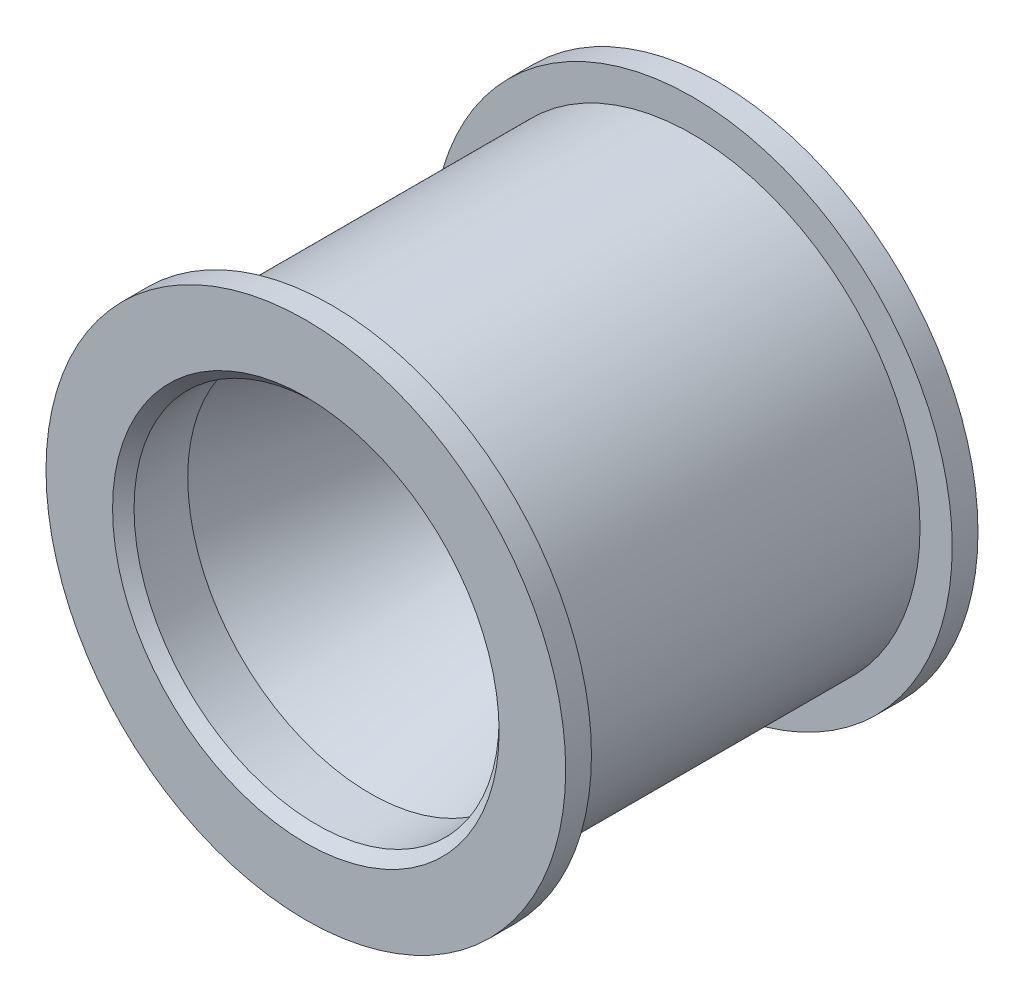
ISO-10303-21;
HEADER;
FILE_DESCRIPTION(('STEP AP214'),'2;1');
FILE_NAME('part.step','',(''),(''),'','','');
FILE_SCHEMA(('AUTOMOTIVE_DESIGN { 1 0 10303 214 1 1 1 1 }'));
ENDSEC;
DATA;
#1=APPLICATION_CONTEXT('core data for automotive mechanical design processes');
#2=APPLICATION_PROTOCOL_DEFINITION('international standard','automotive_design',2000,#1);
#3=PRODUCT_CONTEXT('',#1,'mechanical');
#4=PRODUCT('Part','Part','',(#3));
#5=PRODUCT_RELATED_PRODUCT_CATEGORY('part','',(#4));
#6=PRODUCT_DEFINITION_FORMATION('','',#4);
#7=PRODUCT_DEFINITION_CONTEXT('part definition',#1,'design');
#8=PRODUCT_DEFINITION('design','',#6,#7);
#9=PRODUCT_DEFINITION_SHAPE('','',#8);
#10=(LENGTH_UNIT() NAMED_UNIT(*) SI_UNIT(.MILLI.,.METRE.));
#11=(NAMED_UNIT(*) PLANE_ANGLE_UNIT() SI_UNIT($,.RADIAN.));
#12=(NAMED_UNIT(*) SI_UNIT($,.STERADIAN.) SOLID_ANGLE_UNIT());
#13=UNCERTAINTY_MEASURE_WITH_UNIT(LENGTH_MEASURE(1.E-05),#10,'distance_accuracy_value','');
#14=(GEOMETRIC_REPRESENTATION_CONTEXT(3) GLOBAL_UNCERTAINTY_ASSIGNED_CONTEXT((#13)) GLOBAL_UNIT_ASSIGNED_CONTEXT((#10,
#11,#12)) REPRESENTATION_CONTEXT('',''));
#15=CARTESIAN_POINT('',(0.,0.,0.));
#16=DIRECTION('',(0.,0.,1.));
#17=DIRECTION('',(1.,0.,0.));
#18=AXIS2_PLACEMENT_3D('',#15,#16,#17);
#19=CARTESIAN_POINT('',(0.,0.,9.6));
#20=DIRECTION('',(0.,0.,-1.));
#21=DIRECTION('',(-1.,0.,0.));
#22=AXIS2_PLACEMENT_3D('',#19,#20,#21);
#23=CYLINDRICAL_SURFACE('',#22,1.65);
#24=CARTESIAN_POINT('',(0.,0.,-3.1));
#25=DIRECTION('',(0.,0.,-1.));
#26=DIRECTION('',(-1.,0.,0.));
#27=AXIS2_PLACEMENT_3D('',#24,#25,#26);
#28=CIRCLE('',#27,1.65);
#29=CARTESIAN_POINT('',(-1.65,0.,-3.1));
#30=VERTEX_POINT('',#29);
#31=EDGE_CURVE('E60',#30,#30,#28,.F.);
#32=ORIENTED_EDGE('',*,*,#31,.T.);
#33=EDGE_LOOP('',(#32));
#34=FACE_BOUND('',#33,.T.);
#35=CARTESIAN_POINT('',(0.,0.,-5.1));
#36=DIRECTION('',(0.,0.,-1.));
#37=DIRECTION('',(-1.,0.,0.));
#38=AXIS2_PLACEMENT_3D('',#35,#36,#37);
#39=CIRCLE('',#38,1.65);
#40=CARTESIAN_POINT('',(-1.65,0.,-5.1));
#41=VERTEX_POINT('',#40);
#42=EDGE_CURVE('E63',#41,#41,#39,.T.);
#43=ORIENTED_EDGE('',*,*,#42,.T.);
#44=EDGE_LOOP('',(#43));
#45=FACE_BOUND('',#44,.T.);
#46=ADVANCED_FACE('F37',(#34,#45),#23,.F.);
#47=CARTESIAN_POINT('',(0.,0.,-8.4));
#48=DIRECTION('',(0.,0.,1.));
#49=DIRECTION('',(1.,0.,0.));
#50=AXIS2_PLACEMENT_3D('',#47,#48,#49);
#51=CYLINDRICAL_SURFACE('',#50,10.6);
#52=CARTESIAN_POINT('',(0.,0.,-8.4));
#53=DIRECTION('',(0.,0.,1.));
#54=DIRECTION('',(1.,0.,0.));
#55=AXIS2_PLACEMENT_3D('',#52,#53,#54);
#56=CIRCLE('',#55,10.6);
#57=CARTESIAN_POINT('',(10.6,0.,-8.4));
#58=VERTEX_POINT('',#57);
#59=EDGE_CURVE('E76',#58,#58,#56,.T.);
#60=ORIENTED_EDGE('',*,*,#59,.T.);
#61=EDGE_LOOP('',(#60));
#62=FACE_BOUND('',#61,.T.);
#63=CARTESIAN_POINT('',(0.,0.,8.4));
#64=DIRECTION('',(0.,0.,1.));
#65=DIRECTION('',(1.,0.,0.));
#66=AXIS2_PLACEMENT_3D('',#63,#64,#65);
#67=CIRCLE('',#66,10.6);
#68=CARTESIAN_POINT('',(10.6,0.,8.4));
#69=VERTEX_POINT('',#68);
#70=EDGE_CURVE('E75',#69,#69,#67,.T.);
#71=ORIENTED_EDGE('',*,*,#70,.F.);
#72=EDGE_LOOP('',(#71));
#73=FACE_BOUND('',#72,.T.);
#74=ADVANCED_FACE('F118',(#62,#73),#51,.T.);
#75=CARTESIAN_POINT('',(0.,0.,9.6));
#76=DIRECTION('',(0.,0.,-1.));
#77=DIRECTION('',(-1.,0.,0.));
#78=AXIS2_PLACEMENT_3D('',#75,#76,#77);
#79=CYLINDRICAL_SURFACE('',#78,12.1);
#80=CARTESIAN_POINT('',(0.,0.,9.6));
#81=DIRECTION('',(0.,0.,1.));
#82=DIRECTION('',(1.,0.,0.));
#83=AXIS2_PLACEMENT_3D('',#80,#81,#82);
#84=CIRCLE('',#83,12.1);
#85=CARTESIAN_POINT('',(12.1,0.,9.6));
#86=VERTEX_POINT('',#85);
#87=EDGE_CURVE('E83',#86,#86,#84,.T.);
#88=ORIENTED_EDGE('',*,*,#87,.F.);
#89=EDGE_LOOP('',(#88));
#90=FACE_BOUND('',#89,.T.);
#91=CARTESIAN_POINT('',(0.,0.,8.4));
#92=DIRECTION('',(0.,0.,1.));
#93=DIRECTION('',(1.,0.,0.));
#94=AXIS2_PLACEMENT_3D('',#91,#92,#93);
#95=CIRCLE('',#94,12.1);
#96=CARTESIAN_POINT('',(12.1,0.,8.4));
#97=VERTEX_POINT('',#96);
#98=EDGE_CURVE('E79',#97,#97,#95,.T.);
#99=ORIENTED_EDGE('',*,*,#98,.T.);
#100=EDGE_LOOP('',(#99));
#101=FACE_BOUND('',#100,.T.);
#102=ADVANCED_FACE('F124',(#90,#101),#79,.T.);
#103=CARTESIAN_POINT('',(0.,0.,9.6));
#104=DIRECTION('',(0.,0.,1.));
#105=DIRECTION('',(1.,0.,0.));
#106=AXIS2_PLACEMENT_3D('',#103,#104,#105);
#107=PLANE('',#106);
#108=CARTESIAN_POINT('',(0.,0.,9.6));
#109=DIRECTION('',(0.,0.,1.));
#110=DIRECTION('',(1.,0.,0.));
#111=AXIS2_PLACEMENT_3D('',#108,#109,#110);
#112=CIRCLE('',#111,9.);
#113=CARTESIAN_POINT('',(9.,0.,9.6));
#114=VERTEX_POINT('',#113);
#115=EDGE_CURVE('E44',#114,#114,#112,.F.);
#116=ORIENTED_EDGE('',*,*,#115,.T.);
#117=EDGE_LOOP('',(#116));
#118=FACE_BOUND('',#117,.T.);
#119=ORIENTED_EDGE('',*,*,#87,.T.);
#120=EDGE_LOOP('',(#119));
#121=FACE_BOUND('',#120,.T.);
#122=ADVANCED_FACE('F146',(#118,#121),#107,.T.);
#123=CARTESIAN_POINT('',(0.,0.,8.4));
#124=DIRECTION('',(0.,0.,1.));
#125=DIRECTION('',(1.,0.,0.));
#126=AXIS2_PLACEMENT_3D('',#123,#124,#125);
#127=PLANE('',#126);
#128=ORIENTED_EDGE('',*,*,#70,.T.);
#129=EDGE_LOOP('',(#128));
#130=FACE_BOUND('',#129,.T.);
#131=ORIENTED_EDGE('',*,*,#98,.F.);
#132=EDGE_LOOP('',(#131));
#133=FACE_BOUND('',#132,.T.);
#134=ADVANCED_FACE('F144',(#130,#133),#127,.F.);
#135=CARTESIAN_POINT('',(0.,0.,-9.6));
#136=DIRECTION('',(0.,0.,1.));
#137=DIRECTION('',(1.,0.,0.));
#138=AXIS2_PLACEMENT_3D('',#135,#136,#137);
#139=CYLINDRICAL_SURFACE('',#138,12.1);
#140=CARTESIAN_POINT('',(0.,0.,-9.6));
#141=DIRECTION('',(0.,0.,1.));
#142=DIRECTION('',(1.,0.,0.));
#143=AXIS2_PLACEMENT_3D('',#140,#141,#142);
#144=CIRCLE('',#143,12.1);
#145=CARTESIAN_POINT('',(12.1,0.,-9.6));
#146=VERTEX_POINT('',#145);
#147=EDGE_CURVE('E80',#146,#146,#144,.T.);
#148=ORIENTED_EDGE('',*,*,#147,.T.);
#149=EDGE_LOOP('',(#148));
#150=FACE_BOUND('',#149,.T.);
#151=CARTESIAN_POINT('',(0.,0.,-8.4));
#152=DIRECTION('',(0.,0.,1.));
#153=DIRECTION('',(1.,0.,0.));
#154=AXIS2_PLACEMENT_3D('',#151,#152,#153);
#155=CIRCLE('',#154,12.1);
#156=CARTESIAN_POINT('',(12.1,0.,-8.4));
#157=VERTEX_POINT('',#156);
#158=EDGE_CURVE('E88',#157,#157,#155,.T.);
#159=ORIENTED_EDGE('',*,*,#158,.F.);
#160=EDGE_LOOP('',(#159));
#161=FACE_BOUND('',#160,.T.);
#162=ADVANCED_FACE('F136',(#150,#161),#139,.T.);
#163=CARTESIAN_POINT('',(0.,0.,-9.6));
#164=DIRECTION('',(0.,0.,-1.));
#165=DIRECTION('',(1.,0.,0.));
#166=AXIS2_PLACEMENT_3D('',#163,#164,#165);
#167=PLANE('',#166);
#168=CARTESIAN_POINT('',(0.,0.,-9.6));
#169=DIRECTION('',(0.,0.,-1.));
#170=DIRECTION('',(-1.,0.,0.));
#171=AXIS2_PLACEMENT_3D('',#168,#169,#170);
#172=CIRCLE('',#171,4.60000000000001);
#173=CARTESIAN_POINT('',(-4.60000000000001,0.,-9.6));
#174=VERTEX_POINT('',#173);
#175=EDGE_CURVE('E48',#174,#174,#172,.F.);
#176=ORIENTED_EDGE('',*,*,#175,.T.);
#177=EDGE_LOOP('',(#176));
#178=FACE_BOUND('',#177,.T.);
#179=ORIENTED_EDGE('',*,*,#147,.F.);
#180=EDGE_LOOP('',(#179));
#181=FACE_BOUND('',#180,.T.);
#182=ADVANCED_FACE('F132',(#178,#181),#167,.T.);
#183=CARTESIAN_POINT('',(0.,0.,-8.4));
#184=DIRECTION('',(0.,0.,-1.));
#185=DIRECTION('',(1.,0.,0.));
#186=AXIS2_PLACEMENT_3D('',#183,#184,#185);
#187=PLANE('',#186);
#188=ORIENTED_EDGE('',*,*,#59,.F.);
#189=EDGE_LOOP('',(#188));
#190=FACE_BOUND('',#189,.T.);
#191=ORIENTED_EDGE('',*,*,#158,.T.);
#192=EDGE_LOOP('',(#191));
#193=FACE_BOUND('',#192,.T.);
#194=ADVANCED_FACE('F135',(#190,#193),#187,.F.);
#195=CARTESIAN_POINT('',(0.,0.,-5.6));
#196=DIRECTION('',(0.,0.,-1.));
#197=DIRECTION('',(-1.,0.,0.));
#198=AXIS2_PLACEMENT_3D('',#195,#196,#197);
#199=PLANE('',#198);
#200=CARTESIAN_POINT('',(0.,0.,-5.6));
#201=DIRECTION('',(0.,0.,-1.));
#202=DIRECTION('',(-1.,0.,0.));
#203=AXIS2_PLACEMENT_3D('',#200,#201,#202);
#204=CIRCLE('',#203,2.15);
#205=CARTESIAN_POINT('',(-2.15,0.,-5.6));
#206=VERTEX_POINT('',#205);
#207=EDGE_CURVE('E57',#206,#206,#204,.F.);
#208=ORIENTED_EDGE('',*,*,#207,.T.);
#209=EDGE_LOOP('',(#208));
#210=FACE_BOUND('',#209,.T.);
#211=CARTESIAN_POINT('',(0.,0.,-5.6));
#212=DIRECTION('',(0.,0.,-1.));
#213=DIRECTION('',(-1.,0.,0.));
#214=AXIS2_PLACEMENT_3D('',#211,#212,#213);
#215=CIRCLE('',#214,4.1);
#216=CARTESIAN_POINT('',(-4.1,0.,-5.6));
#217=VERTEX_POINT('',#216);
#218=EDGE_CURVE('E91',#217,#217,#215,.T.);
#219=ORIENTED_EDGE('',*,*,#218,.T.);
#220=EDGE_LOOP('',(#219));
#221=FACE_BOUND('',#220,.T.);
#222=ADVANCED_FACE('F140',(#210,#221),#199,.T.);
#223=CARTESIAN_POINT('',(0.,0.,-5.6));
#224=DIRECTION('',(0.,0.,-1.));
#225=DIRECTION('',(-1.,0.,0.));
#226=AXIS2_PLACEMENT_3D('',#223,#224,#225);
#227=CYLINDRICAL_SURFACE('',#226,4.1);
#228=CARTESIAN_POINT('',(0.,0.,-9.09999999999999));
#229=DIRECTION('',(0.,0.,-1.));
#230=DIRECTION('',(-1.,0.,0.));
#231=AXIS2_PLACEMENT_3D('',#228,#229,#230);
#232=CIRCLE('',#231,4.1);
#233=CARTESIAN_POINT('',(-4.1,0.,-9.09999999999999));
#234=VERTEX_POINT('',#233);
#235=EDGE_CURVE('E52',#234,#234,#232,.T.);
#236=ORIENTED_EDGE('',*,*,#235,.T.);
#237=EDGE_LOOP('',(#236));
#238=FACE_BOUND('',#237,.T.);
#239=ORIENTED_EDGE('',*,*,#218,.F.);
#240=EDGE_LOOP('',(#239));
#241=FACE_BOUND('',#240,.T.);
#242=ADVANCED_FACE('F130',(#238,#241),#227,.F.);
#243=CARTESIAN_POINT('',(0.,6.,-2.6));
#244=DIRECTION('',(0.,0.,-1.));
#245=DIRECTION('',(-1.,0.,0.));
#246=AXIS2_PLACEMENT_3D('',#243,#244,#245);
#247=PLANE('',#246);
#248=CARTESIAN_POINT('',(0.,0.,-2.6));
#249=DIRECTION('',(0.,0.,-1.));
#250=DIRECTION('',(-1.,0.,0.));
#251=AXIS2_PLACEMENT_3D('',#248,#249,#250);
#252=CIRCLE('',#251,5.5);
#253=CARTESIAN_POINT('',(-5.5,0.,-2.6));
#254=VERTEX_POINT('',#253);
#255=EDGE_CURVE('E66',#254,#254,#252,.F.);
#256=ORIENTED_EDGE('',*,*,#255,.T.);
#257=EDGE_LOOP('',(#256));
#258=FACE_BOUND('',#257,.T.);
#259=CARTESIAN_POINT('',(0.,0.,-2.6));
#260=DIRECTION('',(0.,0.,-1.));
#261=DIRECTION('',(-1.,0.,0.));
#262=AXIS2_PLACEMENT_3D('',#259,#260,#261);
#263=CIRCLE('',#262,2.15);
#264=CARTESIAN_POINT('',(-2.15,0.,-2.6));
#265=VERTEX_POINT('',#264);
#266=EDGE_CURVE('E69',#265,#265,#263,.T.);
#267=ORIENTED_EDGE('',*,*,#266,.T.);
#268=EDGE_LOOP('',(#267));
#269=FACE_BOUND('',#268,.T.);
#270=ADVANCED_FACE('F114',(#258,#269),#247,.F.);
#271=CARTESIAN_POINT('',(0.,0.,-8.4));
#272=DIRECTION('',(0.,0.,-1.));
#273=DIRECTION('',(-1.,0.,0.));
#274=AXIS2_PLACEMENT_3D('',#271,#272,#273);
#275=CYLINDRICAL_SURFACE('',#274,8.5);
#276=CARTESIAN_POINT('',(0.,0.,9.09999999999999));
#277=DIRECTION('',(0.,0.,1.));
#278=DIRECTION('',(1.,0.,0.));
#279=AXIS2_PLACEMENT_3D('',#276,#277,#278);
#280=CIRCLE('',#279,8.5);
#281=CARTESIAN_POINT('',(8.5,0.,9.09999999999999));
#282=VERTEX_POINT('',#281);
#283=EDGE_CURVE('E10',#282,#282,#280,.T.);
#284=ORIENTED_EDGE('',*,*,#283,.T.);
#285=EDGE_LOOP('',(#284));
#286=FACE_BOUND('',#285,.T.);
#287=CARTESIAN_POINT('',(0.,0.,6.6));
#288=DIRECTION('',(0.,0.,-1.));
#289=DIRECTION('',(-1.,0.,0.));
#290=AXIS2_PLACEMENT_3D('',#287,#288,#289);
#291=CIRCLE('',#290,8.5);
#292=CARTESIAN_POINT('',(-8.5,0.,6.6));
#293=VERTEX_POINT('',#292);
#294=EDGE_CURVE('E96',#293,#293,#291,.T.);
#295=ORIENTED_EDGE('',*,*,#294,.T.);
#296=EDGE_LOOP('',(#295));
#297=FACE_BOUND('',#296,.T.);
#298=ADVANCED_FACE('F100',(#286,#297),#275,.F.);
#299=CARTESIAN_POINT('',(0.,0.,-2.6));
#300=DIRECTION('',(0.,0.,1.));
#301=DIRECTION('',(1.,0.,0.));
#302=AXIS2_PLACEMENT_3D('',#299,#300,#301);
#303=CONICAL_SURFACE('',#302,6.,0.265332086208985);
#304=CARTESIAN_POINT('',(0.,0.,-1.91343283582088));
#305=DIRECTION('',(0.,0.,1.));
#306=DIRECTION('',(1.,0.,0.));
#307=AXIS2_PLACEMENT_3D('',#304,#305,#306);
#308=CIRCLE('',#307,6.18656716417911);
#309=CARTESIAN_POINT('',(6.18656716417911,0.,-1.91343283582088));
#310=VERTEX_POINT('',#309);
#311=EDGE_CURVE('E72',#310,#310,#308,.F.);
#312=ORIENTED_EDGE('',*,*,#311,.T.);
#313=EDGE_LOOP('',(#312));
#314=FACE_BOUND('',#313,.T.);
#315=ORIENTED_EDGE('',*,*,#294,.F.);
#316=EDGE_LOOP('',(#315));
#317=FACE_BOUND('',#316,.T.);
#318=ADVANCED_FACE('F102',(#314,#317),#303,.F.);
#319=CARTESIAN_POINT('',(0.,0.,-1.91343283582088));
#320=DIRECTION('',(0.,0.,1.));
#321=DIRECTION('',(1.,0.,0.));
#322=AXIS2_PLACEMENT_3D('',#319,#320,#321);
#323=CONICAL_SURFACE('',#322,6.18656716417911,0.785398163397442);
#324=ORIENTED_EDGE('',*,*,#255,.F.);
#325=EDGE_LOOP('',(#324));
#326=FACE_BOUND('',#325,.T.);
#327=ORIENTED_EDGE('',*,*,#311,.F.);
#328=EDGE_LOOP('',(#327));
#329=FACE_BOUND('',#328,.T.);
#330=ADVANCED_FACE('F104',(#326,#329),#323,.F.);
#331=CARTESIAN_POINT('',(0.,0.,-3.1));
#332=DIRECTION('',(0.,0.,1.));
#333=DIRECTION('',(1.,0.,0.));
#334=AXIS2_PLACEMENT_3D('',#331,#332,#333);
#335=CONICAL_SURFACE('',#334,1.65,0.785398163397447);
#336=ORIENTED_EDGE('',*,*,#266,.F.);
#337=EDGE_LOOP('',(#336));
#338=FACE_BOUND('',#337,.T.);
#339=ORIENTED_EDGE('',*,*,#31,.F.);
#340=EDGE_LOOP('',(#339));
#341=FACE_BOUND('',#340,.T.);
#342=ADVANCED_FACE('F111',(#338,#341),#335,.F.);
#343=CARTESIAN_POINT('',(0.,0.,-5.6));
#344=DIRECTION('',(0.,0.,-1.));
#345=DIRECTION('',(-1.,0.,0.));
#346=AXIS2_PLACEMENT_3D('',#343,#344,#345);
#347=CONICAL_SURFACE('',#346,2.15,0.785398163397443);
#348=ORIENTED_EDGE('',*,*,#42,.F.);
#349=EDGE_LOOP('',(#348));
#350=FACE_BOUND('',#349,.T.);
#351=ORIENTED_EDGE('',*,*,#207,.F.);
#352=EDGE_LOOP('',(#351));
#353=FACE_BOUND('',#352,.T.);
#354=ADVANCED_FACE('F157',(#350,#353),#347,.F.);
#355=CARTESIAN_POINT('',(0.,0.,-9.09999999999999));
#356=DIRECTION('',(0.,0.,-1.));
#357=DIRECTION('',(-1.,0.,0.));
#358=AXIS2_PLACEMENT_3D('',#355,#356,#357);
#359=CONICAL_SURFACE('',#358,4.1,0.785398163397448);
#360=ORIENTED_EDGE('',*,*,#175,.F.);
#361=EDGE_LOOP('',(#360));
#362=FACE_BOUND('',#361,.T.);
#363=ORIENTED_EDGE('',*,*,#235,.F.);
#364=EDGE_LOOP('',(#363));
#365=FACE_BOUND('',#364,.T.);
#366=ADVANCED_FACE('F160',(#362,#365),#359,.F.);
#367=CARTESIAN_POINT('',(0.,0.,9.6));
#368=DIRECTION('',(0.,0.,1.));
#369=DIRECTION('',(1.,0.,0.));
#370=AXIS2_PLACEMENT_3D('',#367,#368,#369);
#371=CONICAL_SURFACE('',#370,9.,0.785398163397441);
#372=ORIENTED_EDGE('',*,*,#283,.F.);
#373=EDGE_LOOP('',(#372));
#374=FACE_BOUND('',#373,.T.);
#375=ORIENTED_EDGE('',*,*,#115,.F.);
#376=EDGE_LOOP('',(#375));
#377=FACE_BOUND('',#376,.T.);
#378=ADVANCED_FACE('F39',(#374,#377),#371,.F.);
#379=CLOSED_SHELL('',(#46,#74,#102,#122,#134,#162,#182,#194,#222,#242,#270,#298,#318,#330,#342,
#354,#366,#378));
#380=MANIFOLD_SOLID_BREP('B2',#379);
#381=ADVANCED_BREP_SHAPE_REPRESENTATION('',(#18,#380),#14);
#382=SHAPE_DEFINITION_REPRESENTATION(#9,#381);
ENDSEC;
END-ISO-10303-21;
